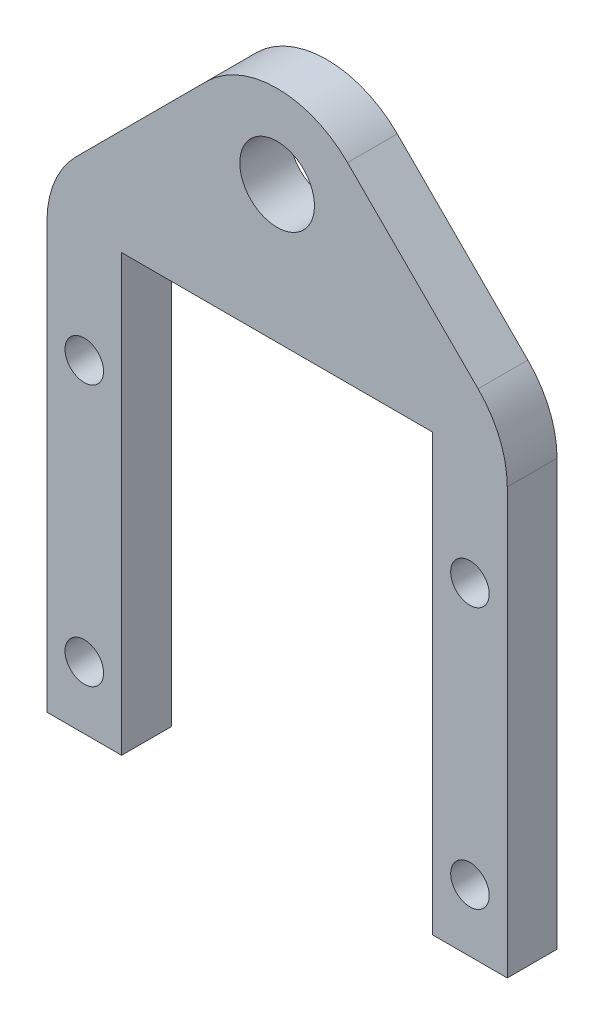
ISO-10303-21;
HEADER;
FILE_DESCRIPTION(('STEP AP214'),'2;1');
FILE_NAME('part.step','',(''),(''),'','','');
FILE_SCHEMA(('AUTOMOTIVE_DESIGN { 1 0 10303 214 1 1 1 1 }'));
ENDSEC;
DATA;
#1=APPLICATION_CONTEXT('core data for automotive mechanical design processes');
#2=APPLICATION_PROTOCOL_DEFINITION('international standard','automotive_design',2000,#1);
#3=PRODUCT_CONTEXT('',#1,'mechanical');
#4=PRODUCT('Part','Part','',(#3));
#5=PRODUCT_RELATED_PRODUCT_CATEGORY('part','',(#4));
#6=PRODUCT_DEFINITION_FORMATION('','',#4);
#7=PRODUCT_DEFINITION_CONTEXT('part definition',#1,'design');
#8=PRODUCT_DEFINITION('design','',#6,#7);
#9=PRODUCT_DEFINITION_SHAPE('','',#8);
#10=(LENGTH_UNIT() NAMED_UNIT(*) SI_UNIT(.MILLI.,.METRE.));
#11=(NAMED_UNIT(*) PLANE_ANGLE_UNIT() SI_UNIT($,.RADIAN.));
#12=(NAMED_UNIT(*) SI_UNIT($,.STERADIAN.) SOLID_ANGLE_UNIT());
#13=UNCERTAINTY_MEASURE_WITH_UNIT(LENGTH_MEASURE(1.E-05),#10,'distance_accuracy_value','');
#14=(GEOMETRIC_REPRESENTATION_CONTEXT(3) GLOBAL_UNCERTAINTY_ASSIGNED_CONTEXT((#13)) GLOBAL_UNIT_ASSIGNED_CONTEXT((#10,
#11,#12)) REPRESENTATION_CONTEXT('',''));
#15=CARTESIAN_POINT('',(0.,0.,0.));
#16=DIRECTION('',(0.,0.,1.));
#17=DIRECTION('',(1.,0.,0.));
#18=AXIS2_PLACEMENT_3D('',#15,#16,#17);
#19=CARTESIAN_POINT('',(0.,0.,4.));
#20=DIRECTION('',(0.,0.,-1.));
#21=DIRECTION('',(-1.,0.,0.));
#22=AXIS2_PLACEMENT_3D('',#19,#20,#21);
#23=PLANE('',#22);
#24=DIRECTION('',(-0.707106781186548,-0.707106781186547,0.));
#25=VECTOR('',#24,1.);
#26=CARTESIAN_POINT('',(-18.5,37.5,4.));
#27=LINE('',#26,#25);
#28=CARTESIAN_POINT('',(-5.65685424949239,50.3431457505076,4.));
#29=VERTEX_POINT('',#28);
#30=CARTESIAN_POINT('',(-16.1568542494924,39.8431457505076,4.));
#31=VERTEX_POINT('',#30);
#32=EDGE_CURVE('E227',#29,#31,#27,.T.);
#33=ORIENTED_EDGE('',*,*,#32,.T.);
#34=CARTESIAN_POINT('',(-10.5,34.1862915010152,4.));
#35=DIRECTION('',(0.,0.,-1.));
#36=DIRECTION('',(-1.,0.,0.));
#37=AXIS2_PLACEMENT_3D('',#34,#35,#36);
#38=CIRCLE('',#37,8.);
#39=CARTESIAN_POINT('',(-18.5,34.1862915010152,4.));
#40=VERTEX_POINT('',#39);
#41=EDGE_CURVE('E172',#31,#40,#38,.F.);
#42=ORIENTED_EDGE('',*,*,#41,.T.);
#43=DIRECTION('',(0.,-1.,0.));
#44=VECTOR('',#43,1.);
#45=CARTESIAN_POINT('',(-18.5,0.,4.));
#46=LINE('',#45,#44);
#47=CARTESIAN_POINT('',(-18.5,0.,4.));
#48=VERTEX_POINT('',#47);
#49=EDGE_CURVE('E225',#40,#48,#46,.T.);
#50=ORIENTED_EDGE('',*,*,#49,.T.);
#51=DIRECTION('',(1.,0.,0.));
#52=VECTOR('',#51,1.);
#53=CARTESIAN_POINT('',(-12.5,0.,4.));
#54=LINE('',#53,#52);
#55=CARTESIAN_POINT('',(-12.5,0.,4.));
#56=VERTEX_POINT('',#55);
#57=EDGE_CURVE('E141',#48,#56,#54,.T.);
#58=ORIENTED_EDGE('',*,*,#57,.T.);
#59=DIRECTION('',(0.,1.,0.));
#60=VECTOR('',#59,1.);
#61=CARTESIAN_POINT('',(-12.5,0.,4.));
#62=LINE('',#61,#60);
#63=CARTESIAN_POINT('',(-12.5,35.,4.));
#64=VERTEX_POINT('',#63);
#65=EDGE_CURVE('E135',#56,#64,#62,.T.);
#66=ORIENTED_EDGE('',*,*,#65,.T.);
#67=DIRECTION('',(1.,0.,0.));
#68=VECTOR('',#67,1.);
#69=CARTESIAN_POINT('',(-12.5,35.,4.));
#70=LINE('',#69,#68);
#71=CARTESIAN_POINT('',(12.5,35.,4.));
#72=VERTEX_POINT('',#71);
#73=EDGE_CURVE('E125',#64,#72,#70,.T.);
#74=ORIENTED_EDGE('',*,*,#73,.T.);
#75=DIRECTION('',(0.,-1.,0.));
#76=VECTOR('',#75,1.);
#77=CARTESIAN_POINT('',(12.5,0.,4.));
#78=LINE('',#77,#76);
#79=CARTESIAN_POINT('',(12.5,0.,4.));
#80=VERTEX_POINT('',#79);
#81=EDGE_CURVE('E134',#72,#80,#78,.T.);
#82=ORIENTED_EDGE('',*,*,#81,.T.);
#83=DIRECTION('',(1.,0.,0.));
#84=VECTOR('',#83,1.);
#85=CARTESIAN_POINT('',(18.5,0.,4.));
#86=LINE('',#85,#84);
#87=CARTESIAN_POINT('',(18.5,0.,4.));
#88=VERTEX_POINT('',#87);
#89=EDGE_CURVE('E214',#80,#88,#86,.T.);
#90=ORIENTED_EDGE('',*,*,#89,.T.);
#91=DIRECTION('',(0.,1.,0.));
#92=VECTOR('',#91,1.);
#93=CARTESIAN_POINT('',(18.5,37.5,4.));
#94=LINE('',#93,#92);
#95=CARTESIAN_POINT('',(18.5,34.1862915010152,4.));
#96=VERTEX_POINT('',#95);
#97=EDGE_CURVE('E230',#88,#96,#94,.T.);
#98=ORIENTED_EDGE('',*,*,#97,.T.);
#99=CARTESIAN_POINT('',(10.5,34.1862915010152,4.));
#100=DIRECTION('',(0.,0.,-1.));
#101=DIRECTION('',(-1.,0.,0.));
#102=AXIS2_PLACEMENT_3D('',#99,#100,#101);
#103=CIRCLE('',#102,8.);
#104=CARTESIAN_POINT('',(16.1568542494924,39.8431457505076,4.));
#105=VERTEX_POINT('',#104);
#106=EDGE_CURVE('E57',#96,#105,#103,.F.);
#107=ORIENTED_EDGE('',*,*,#106,.T.);
#108=DIRECTION('',(-0.707106781186548,0.707106781186548,0.));
#109=VECTOR('',#108,1.);
#110=CARTESIAN_POINT('',(0.,56.,4.));
#111=LINE('',#110,#109);
#112=CARTESIAN_POINT('',(5.65685424949238,50.3431457505076,4.));
#113=VERTEX_POINT('',#112);
#114=EDGE_CURVE('E179',#105,#113,#111,.T.);
#115=ORIENTED_EDGE('',*,*,#114,.T.);
#116=CARTESIAN_POINT('',(0.,44.6862915010152,4.));
#117=DIRECTION('',(0.,0.,-1.));
#118=DIRECTION('',(-1.,0.,0.));
#119=AXIS2_PLACEMENT_3D('',#116,#117,#118);
#120=CIRCLE('',#119,8.);
#121=EDGE_CURVE('E169',#113,#29,#120,.F.);
#122=ORIENTED_EDGE('',*,*,#121,.T.);
#123=EDGE_LOOP('',(#33,#42,#50,#58,#66,#74,#82,#90,#98,#107,#115,#122));
#124=FACE_BOUND('',#123,.T.);
#125=CARTESIAN_POINT('',(-15.5,26.,4.));
#126=DIRECTION('',(0.,0.,1.));
#127=DIRECTION('',(1.,0.,0.));
#128=AXIS2_PLACEMENT_3D('',#125,#126,#127);
#129=CIRCLE('',#128,1.55);
#130=CARTESIAN_POINT('',(-13.95,26.,4.));
#131=VERTEX_POINT('',#130);
#132=EDGE_CURVE('E223',#131,#131,#129,.T.);
#133=ORIENTED_EDGE('',*,*,#132,.F.);
#134=EDGE_LOOP('',(#133));
#135=FACE_BOUND('',#134,.T.);
#136=CARTESIAN_POINT('',(-15.5,5.,4.));
#137=DIRECTION('',(0.,0.,1.));
#138=DIRECTION('',(1.,0.,0.));
#139=AXIS2_PLACEMENT_3D('',#136,#137,#138);
#140=CIRCLE('',#139,1.55);
#141=CARTESIAN_POINT('',(-13.95,5.,4.));
#142=VERTEX_POINT('',#141);
#143=EDGE_CURVE('E237',#142,#142,#140,.T.);
#144=ORIENTED_EDGE('',*,*,#143,.F.);
#145=EDGE_LOOP('',(#144));
#146=FACE_BOUND('',#145,.T.);
#147=CARTESIAN_POINT('',(15.5,5.,4.));
#148=DIRECTION('',(0.,0.,1.));
#149=DIRECTION('',(-1.,0.,0.));
#150=AXIS2_PLACEMENT_3D('',#147,#148,#149);
#151=CIRCLE('',#150,1.55);
#152=CARTESIAN_POINT('',(13.95,5.,4.));
#153=VERTEX_POINT('',#152);
#154=EDGE_CURVE('E243',#153,#153,#151,.T.);
#155=ORIENTED_EDGE('',*,*,#154,.F.);
#156=EDGE_LOOP('',(#155));
#157=FACE_BOUND('',#156,.T.);
#158=CARTESIAN_POINT('',(0.,46.,4.));
#159=DIRECTION('',(0.,0.,1.));
#160=DIRECTION('',(1.,0.,0.));
#161=AXIS2_PLACEMENT_3D('',#158,#159,#160);
#162=CIRCLE('',#161,3.);
#163=CARTESIAN_POINT('',(3.,46.,4.));
#164=VERTEX_POINT('',#163);
#165=EDGE_CURVE('E249',#164,#164,#162,.T.);
#166=ORIENTED_EDGE('',*,*,#165,.F.);
#167=EDGE_LOOP('',(#166));
#168=FACE_BOUND('',#167,.T.);
#169=CARTESIAN_POINT('',(15.5,26.,4.));
#170=DIRECTION('',(0.,0.,1.));
#171=DIRECTION('',(-1.,0.,0.));
#172=AXIS2_PLACEMENT_3D('',#169,#170,#171);
#173=CIRCLE('',#172,1.55);
#174=CARTESIAN_POINT('',(13.95,26.,4.));
#175=VERTEX_POINT('',#174);
#176=EDGE_CURVE('E255',#175,#175,#173,.T.);
#177=ORIENTED_EDGE('',*,*,#176,.F.);
#178=EDGE_LOOP('',(#177));
#179=FACE_BOUND('',#178,.T.);
#180=ADVANCED_FACE('F35',(#124,#135,#146,#157,#168,#179),#23,.F.);
#181=CARTESIAN_POINT('',(0.,0.,0.));
#182=DIRECTION('',(0.,0.,-1.));
#183=DIRECTION('',(-1.,0.,0.));
#184=AXIS2_PLACEMENT_3D('',#181,#182,#183);
#185=PLANE('',#184);
#186=CARTESIAN_POINT('',(0.,46.,0.));
#187=DIRECTION('',(0.,0.,1.));
#188=DIRECTION('',(1.,0.,0.));
#189=AXIS2_PLACEMENT_3D('',#186,#187,#188);
#190=CIRCLE('',#189,3.);
#191=CARTESIAN_POINT('',(3.,46.,0.));
#192=VERTEX_POINT('',#191);
#193=EDGE_CURVE('E252',#192,#192,#190,.T.);
#194=ORIENTED_EDGE('',*,*,#193,.T.);
#195=EDGE_LOOP('',(#194));
#196=FACE_BOUND('',#195,.T.);
#197=CARTESIAN_POINT('',(-15.5,5.,0.));
#198=DIRECTION('',(0.,0.,1.));
#199=DIRECTION('',(1.,0.,0.));
#200=AXIS2_PLACEMENT_3D('',#197,#198,#199);
#201=CIRCLE('',#200,1.55);
#202=CARTESIAN_POINT('',(-13.95,5.,0.));
#203=VERTEX_POINT('',#202);
#204=EDGE_CURVE('E240',#203,#203,#201,.T.);
#205=ORIENTED_EDGE('',*,*,#204,.T.);
#206=EDGE_LOOP('',(#205));
#207=FACE_BOUND('',#206,.T.);
#208=DIRECTION('',(0.,-1.,0.));
#209=VECTOR('',#208,1.);
#210=CARTESIAN_POINT('',(-18.5,0.,0.));
#211=LINE('',#210,#209);
#212=CARTESIAN_POINT('',(-18.5,34.1862915010152,0.));
#213=VERTEX_POINT('',#212);
#214=CARTESIAN_POINT('',(-18.5,0.,0.));
#215=VERTEX_POINT('',#214);
#216=EDGE_CURVE('E192',#213,#215,#211,.T.);
#217=ORIENTED_EDGE('',*,*,#216,.F.);
#218=CARTESIAN_POINT('',(-10.5,34.1862915010152,0.));
#219=DIRECTION('',(0.,0.,-1.));
#220=DIRECTION('',(-1.,0.,0.));
#221=AXIS2_PLACEMENT_3D('',#218,#219,#220);
#222=CIRCLE('',#221,8.);
#223=CARTESIAN_POINT('',(-16.1568542494924,39.8431457505076,0.));
#224=VERTEX_POINT('',#223);
#225=EDGE_CURVE('E162',#213,#224,#222,.T.);
#226=ORIENTED_EDGE('',*,*,#225,.T.);
#227=DIRECTION('',(-0.707106781186548,-0.707106781186547,0.));
#228=VECTOR('',#227,1.);
#229=CARTESIAN_POINT('',(-18.5,37.5,0.));
#230=LINE('',#229,#228);
#231=CARTESIAN_POINT('',(-5.65685424949239,50.3431457505076,0.));
#232=VERTEX_POINT('',#231);
#233=EDGE_CURVE('E188',#232,#224,#230,.T.);
#234=ORIENTED_EDGE('',*,*,#233,.F.);
#235=CARTESIAN_POINT('',(0.,44.6862915010152,0.));
#236=DIRECTION('',(0.,0.,-1.));
#237=DIRECTION('',(-1.,0.,0.));
#238=AXIS2_PLACEMENT_3D('',#235,#236,#237);
#239=CIRCLE('',#238,8.);
#240=CARTESIAN_POINT('',(5.65685424949238,50.3431457505076,0.));
#241=VERTEX_POINT('',#240);
#242=EDGE_CURVE('E153',#232,#241,#239,.T.);
#243=ORIENTED_EDGE('',*,*,#242,.T.);
#244=DIRECTION('',(-0.707106781186548,0.707106781186548,0.));
#245=VECTOR('',#244,1.);
#246=CARTESIAN_POINT('',(0.,56.,0.));
#247=LINE('',#246,#245);
#248=CARTESIAN_POINT('',(16.1568542494924,39.8431457505076,0.));
#249=VERTEX_POINT('',#248);
#250=EDGE_CURVE('E178',#249,#241,#247,.T.);
#251=ORIENTED_EDGE('',*,*,#250,.F.);
#252=CARTESIAN_POINT('',(10.5,34.1862915010152,0.));
#253=DIRECTION('',(0.,0.,-1.));
#254=DIRECTION('',(-1.,0.,0.));
#255=AXIS2_PLACEMENT_3D('',#252,#253,#254);
#256=CIRCLE('',#255,8.);
#257=CARTESIAN_POINT('',(18.5,34.1862915010152,0.));
#258=VERTEX_POINT('',#257);
#259=EDGE_CURVE('E160',#249,#258,#256,.T.);
#260=ORIENTED_EDGE('',*,*,#259,.T.);
#261=DIRECTION('',(0.,1.,0.));
#262=VECTOR('',#261,1.);
#263=CARTESIAN_POINT('',(18.5,37.5,0.));
#264=LINE('',#263,#262);
#265=CARTESIAN_POINT('',(18.5,0.,0.));
#266=VERTEX_POINT('',#265);
#267=EDGE_CURVE('E189',#266,#258,#264,.T.);
#268=ORIENTED_EDGE('',*,*,#267,.F.);
#269=DIRECTION('',(1.,0.,0.));
#270=VECTOR('',#269,1.);
#271=CARTESIAN_POINT('',(18.5,0.,0.));
#272=LINE('',#271,#270);
#273=CARTESIAN_POINT('',(12.5,0.,0.));
#274=VERTEX_POINT('',#273);
#275=EDGE_CURVE('E194',#274,#266,#272,.T.);
#276=ORIENTED_EDGE('',*,*,#275,.F.);
#277=DIRECTION('',(0.,-1.,0.));
#278=VECTOR('',#277,1.);
#279=CARTESIAN_POINT('',(12.5,0.,0.));
#280=LINE('',#279,#278);
#281=CARTESIAN_POINT('',(12.5,35.,0.));
#282=VERTEX_POINT('',#281);
#283=EDGE_CURVE('E217',#282,#274,#280,.T.);
#284=ORIENTED_EDGE('',*,*,#283,.F.);
#285=DIRECTION('',(1.,0.,0.));
#286=VECTOR('',#285,1.);
#287=CARTESIAN_POINT('',(-12.5,35.,0.));
#288=LINE('',#287,#286);
#289=CARTESIAN_POINT('',(-12.5,35.,0.));
#290=VERTEX_POINT('',#289);
#291=EDGE_CURVE('E218',#290,#282,#288,.T.);
#292=ORIENTED_EDGE('',*,*,#291,.F.);
#293=DIRECTION('',(0.,1.,0.));
#294=VECTOR('',#293,1.);
#295=CARTESIAN_POINT('',(-12.5,0.,0.));
#296=LINE('',#295,#294);
#297=CARTESIAN_POINT('',(-12.5,0.,0.));
#298=VERTEX_POINT('',#297);
#299=EDGE_CURVE('E149',#298,#290,#296,.T.);
#300=ORIENTED_EDGE('',*,*,#299,.F.);
#301=DIRECTION('',(1.,0.,0.));
#302=VECTOR('',#301,1.);
#303=CARTESIAN_POINT('',(-12.5,0.,0.));
#304=LINE('',#303,#302);
#305=EDGE_CURVE('E145',#215,#298,#304,.T.);
#306=ORIENTED_EDGE('',*,*,#305,.F.);
#307=EDGE_LOOP('',(#217,#226,#234,#243,#251,#260,#268,#276,#284,#292,#300,#306));
#308=FACE_BOUND('',#307,.T.);
#309=CARTESIAN_POINT('',(-15.5,26.,0.));
#310=DIRECTION('',(0.,0.,1.));
#311=DIRECTION('',(1.,0.,0.));
#312=AXIS2_PLACEMENT_3D('',#309,#310,#311);
#313=CIRCLE('',#312,1.55);
#314=CARTESIAN_POINT('',(-13.95,26.,0.));
#315=VERTEX_POINT('',#314);
#316=EDGE_CURVE('E234',#315,#315,#313,.T.);
#317=ORIENTED_EDGE('',*,*,#316,.T.);
#318=EDGE_LOOP('',(#317));
#319=FACE_BOUND('',#318,.T.);
#320=CARTESIAN_POINT('',(15.5,5.,0.));
#321=DIRECTION('',(0.,0.,1.));
#322=DIRECTION('',(-1.,0.,0.));
#323=AXIS2_PLACEMENT_3D('',#320,#321,#322);
#324=CIRCLE('',#323,1.55);
#325=CARTESIAN_POINT('',(13.95,5.,0.));
#326=VERTEX_POINT('',#325);
#327=EDGE_CURVE('E246',#326,#326,#324,.T.);
#328=ORIENTED_EDGE('',*,*,#327,.T.);
#329=EDGE_LOOP('',(#328));
#330=FACE_BOUND('',#329,.T.);
#331=CARTESIAN_POINT('',(15.5,26.,0.));
#332=DIRECTION('',(0.,0.,1.));
#333=DIRECTION('',(-1.,0.,0.));
#334=AXIS2_PLACEMENT_3D('',#331,#332,#333);
#335=CIRCLE('',#334,1.55);
#336=CARTESIAN_POINT('',(13.95,26.,0.));
#337=VERTEX_POINT('',#336);
#338=EDGE_CURVE('E258',#337,#337,#335,.T.);
#339=ORIENTED_EDGE('',*,*,#338,.T.);
#340=EDGE_LOOP('',(#339));
#341=FACE_BOUND('',#340,.T.);
#342=ADVANCED_FACE('F183',(#196,#207,#308,#319,#330,#341),#185,.T.);
#343=CARTESIAN_POINT('',(-12.5,0.,4.));
#344=DIRECTION('',(-1.,0.,0.));
#345=DIRECTION('',(0.,0.,1.));
#346=AXIS2_PLACEMENT_3D('',#343,#344,#345);
#347=PLANE('',#346);
#348=ORIENTED_EDGE('',*,*,#299,.T.);
#349=DIRECTION('',(0.,0.,-1.));
#350=VECTOR('',#349,1.);
#351=CARTESIAN_POINT('',(-12.5,35.,4.));
#352=LINE('',#351,#350);
#353=EDGE_CURVE('E129',#64,#290,#352,.T.);
#354=ORIENTED_EDGE('',*,*,#353,.F.);
#355=ORIENTED_EDGE('',*,*,#65,.F.);
#356=DIRECTION('',(0.,0.,-1.));
#357=VECTOR('',#356,1.);
#358=CARTESIAN_POINT('',(-12.5,0.,4.));
#359=LINE('',#358,#357);
#360=EDGE_CURVE('E200',#56,#298,#359,.T.);
#361=ORIENTED_EDGE('',*,*,#360,.T.);
#362=EDGE_LOOP('',(#348,#354,#355,#361));
#363=FACE_BOUND('',#362,.T.);
#364=ADVANCED_FACE('F147',(#363),#347,.F.);
#365=CARTESIAN_POINT('',(-12.5,35.,4.));
#366=DIRECTION('',(0.,1.,0.));
#367=DIRECTION('',(0.,0.,1.));
#368=AXIS2_PLACEMENT_3D('',#365,#366,#367);
#369=PLANE('',#368);
#370=ORIENTED_EDGE('',*,*,#291,.T.);
#371=DIRECTION('',(0.,0.,-1.));
#372=VECTOR('',#371,1.);
#373=CARTESIAN_POINT('',(12.5,35.,4.));
#374=LINE('',#373,#372);
#375=EDGE_CURVE('E132',#72,#282,#374,.T.);
#376=ORIENTED_EDGE('',*,*,#375,.F.);
#377=ORIENTED_EDGE('',*,*,#73,.F.);
#378=ORIENTED_EDGE('',*,*,#353,.T.);
#379=EDGE_LOOP('',(#370,#376,#377,#378));
#380=FACE_BOUND('',#379,.T.);
#381=ADVANCED_FACE('F127',(#380),#369,.F.);
#382=CARTESIAN_POINT('',(12.5,0.,4.));
#383=DIRECTION('',(1.,0.,0.));
#384=DIRECTION('',(0.,0.,-1.));
#385=AXIS2_PLACEMENT_3D('',#382,#383,#384);
#386=PLANE('',#385);
#387=ORIENTED_EDGE('',*,*,#283,.T.);
#388=DIRECTION('',(0.,0.,-1.));
#389=VECTOR('',#388,1.);
#390=CARTESIAN_POINT('',(12.5,0.,4.));
#391=LINE('',#390,#389);
#392=EDGE_CURVE('E155',#80,#274,#391,.T.);
#393=ORIENTED_EDGE('',*,*,#392,.F.);
#394=ORIENTED_EDGE('',*,*,#81,.F.);
#395=ORIENTED_EDGE('',*,*,#375,.T.);
#396=EDGE_LOOP('',(#387,#393,#394,#395));
#397=FACE_BOUND('',#396,.T.);
#398=ADVANCED_FACE('F298',(#397),#386,.F.);
#399=CARTESIAN_POINT('',(18.5,0.,4.));
#400=DIRECTION('',(0.,1.,0.));
#401=DIRECTION('',(0.,0.,1.));
#402=AXIS2_PLACEMENT_3D('',#399,#400,#401);
#403=PLANE('',#402);
#404=ORIENTED_EDGE('',*,*,#275,.T.);
#405=DIRECTION('',(0.,0.,-1.));
#406=VECTOR('',#405,1.);
#407=CARTESIAN_POINT('',(18.5,0.,4.));
#408=LINE('',#407,#406);
#409=EDGE_CURVE('E205',#88,#266,#408,.T.);
#410=ORIENTED_EDGE('',*,*,#409,.F.);
#411=ORIENTED_EDGE('',*,*,#89,.F.);
#412=ORIENTED_EDGE('',*,*,#392,.T.);
#413=EDGE_LOOP('',(#404,#410,#411,#412));
#414=FACE_BOUND('',#413,.T.);
#415=ADVANCED_FACE('F212',(#414),#403,.F.);
#416=CARTESIAN_POINT('',(18.5,37.5,4.));
#417=DIRECTION('',(-1.,0.,0.));
#418=DIRECTION('',(0.,-1.,0.));
#419=AXIS2_PLACEMENT_3D('',#416,#417,#418);
#420=PLANE('',#419);
#421=ORIENTED_EDGE('',*,*,#267,.T.);
#422=DIRECTION('',(0.,0.,-1.));
#423=VECTOR('',#422,1.);
#424=CARTESIAN_POINT('',(18.5,34.1862915010152,4.));
#425=LINE('',#424,#423);
#426=EDGE_CURVE('E11',#258,#96,#425,.F.);
#427=ORIENTED_EDGE('',*,*,#426,.T.);
#428=ORIENTED_EDGE('',*,*,#97,.F.);
#429=ORIENTED_EDGE('',*,*,#409,.T.);
#430=EDGE_LOOP('',(#421,#427,#428,#429));
#431=FACE_BOUND('',#430,.T.);
#432=ADVANCED_FACE('F292',(#431),#420,.F.);
#433=CARTESIAN_POINT('',(0.,56.,4.));
#434=DIRECTION('',(-0.707106781186547,-0.707106781186547,0.));
#435=DIRECTION('',(0.707106781186548,-0.707106781186548,0.));
#436=AXIS2_PLACEMENT_3D('',#433,#434,#435);
#437=PLANE('',#436);
#438=ORIENTED_EDGE('',*,*,#114,.F.);
#439=DIRECTION('',(0.,0.,-1.));
#440=VECTOR('',#439,1.);
#441=CARTESIAN_POINT('',(16.1568542494924,39.8431457505076,4.));
#442=LINE('',#441,#440);
#443=EDGE_CURVE('E43',#105,#249,#442,.T.);
#444=ORIENTED_EDGE('',*,*,#443,.T.);
#445=ORIENTED_EDGE('',*,*,#250,.T.);
#446=DIRECTION('',(0.,0.,-1.));
#447=VECTOR('',#446,1.);
#448=CARTESIAN_POINT('',(5.65685424949238,50.3431457505076,4.));
#449=LINE('',#448,#447);
#450=EDGE_CURVE('E50',#241,#113,#449,.F.);
#451=ORIENTED_EDGE('',*,*,#450,.T.);
#452=EDGE_LOOP('',(#438,#444,#445,#451));
#453=FACE_BOUND('',#452,.T.);
#454=ADVANCED_FACE('F177',(#453),#437,.F.);
#455=CARTESIAN_POINT('',(-18.5,37.5,4.));
#456=DIRECTION('',(0.707106781186547,-0.707106781186548,0.));
#457=DIRECTION('',(0.707106781186548,0.707106781186547,0.));
#458=AXIS2_PLACEMENT_3D('',#455,#456,#457);
#459=PLANE('',#458);
#460=ORIENTED_EDGE('',*,*,#233,.T.);
#461=DIRECTION('',(0.,0.,-1.));
#462=VECTOR('',#461,1.);
#463=CARTESIAN_POINT('',(-16.1568542494924,39.8431457505076,4.));
#464=LINE('',#463,#462);
#465=EDGE_CURVE('E167',#224,#31,#464,.F.);
#466=ORIENTED_EDGE('',*,*,#465,.T.);
#467=ORIENTED_EDGE('',*,*,#32,.F.);
#468=DIRECTION('',(0.,0.,-1.));
#469=VECTOR('',#468,1.);
#470=CARTESIAN_POINT('',(-5.65685424949239,50.3431457505076,4.));
#471=LINE('',#470,#469);
#472=EDGE_CURVE('E164',#29,#232,#471,.T.);
#473=ORIENTED_EDGE('',*,*,#472,.T.);
#474=EDGE_LOOP('',(#460,#466,#467,#473));
#475=FACE_BOUND('',#474,.T.);
#476=ADVANCED_FACE('F285',(#475),#459,.F.);
#477=CARTESIAN_POINT('',(-18.5,0.,4.));
#478=DIRECTION('',(1.,0.,0.));
#479=DIRECTION('',(0.,0.,-1.));
#480=AXIS2_PLACEMENT_3D('',#477,#478,#479);
#481=PLANE('',#480);
#482=ORIENTED_EDGE('',*,*,#49,.F.);
#483=DIRECTION('',(0.,0.,-1.));
#484=VECTOR('',#483,1.);
#485=CARTESIAN_POINT('',(-18.5,34.1862915010152,4.));
#486=LINE('',#485,#484);
#487=EDGE_CURVE('E150',#40,#213,#486,.T.);
#488=ORIENTED_EDGE('',*,*,#487,.T.);
#489=ORIENTED_EDGE('',*,*,#216,.T.);
#490=DIRECTION('',(0.,0.,-1.));
#491=VECTOR('',#490,1.);
#492=CARTESIAN_POINT('',(-18.5,0.,4.));
#493=LINE('',#492,#491);
#494=EDGE_CURVE('E202',#48,#215,#493,.T.);
#495=ORIENTED_EDGE('',*,*,#494,.F.);
#496=EDGE_LOOP('',(#482,#488,#489,#495));
#497=FACE_BOUND('',#496,.T.);
#498=ADVANCED_FACE('F281',(#497),#481,.F.);
#499=CARTESIAN_POINT('',(-12.5,0.,4.));
#500=DIRECTION('',(0.,1.,0.));
#501=DIRECTION('',(0.,0.,1.));
#502=AXIS2_PLACEMENT_3D('',#499,#500,#501);
#503=PLANE('',#502);
#504=ORIENTED_EDGE('',*,*,#305,.T.);
#505=ORIENTED_EDGE('',*,*,#360,.F.);
#506=ORIENTED_EDGE('',*,*,#57,.F.);
#507=ORIENTED_EDGE('',*,*,#494,.T.);
#508=EDGE_LOOP('',(#504,#505,#506,#507));
#509=FACE_BOUND('',#508,.T.);
#510=ADVANCED_FACE('F278',(#509),#503,.F.);
#511=CARTESIAN_POINT('',(-15.5,26.,4.));
#512=DIRECTION('',(0.,0.,-1.));
#513=DIRECTION('',(-1.,0.,0.));
#514=AXIS2_PLACEMENT_3D('',#511,#512,#513);
#515=CYLINDRICAL_SURFACE('',#514,1.55);
#516=ORIENTED_EDGE('',*,*,#132,.T.);
#517=EDGE_LOOP('',(#516));
#518=FACE_BOUND('',#517,.T.);
#519=ORIENTED_EDGE('',*,*,#316,.F.);
#520=EDGE_LOOP('',(#519));
#521=FACE_BOUND('',#520,.T.);
#522=ADVANCED_FACE('F275',(#518,#521),#515,.F.);
#523=CARTESIAN_POINT('',(-15.5,5.,4.));
#524=DIRECTION('',(0.,0.,-1.));
#525=DIRECTION('',(-1.,0.,0.));
#526=AXIS2_PLACEMENT_3D('',#523,#524,#525);
#527=CYLINDRICAL_SURFACE('',#526,1.55);
#528=ORIENTED_EDGE('',*,*,#143,.T.);
#529=EDGE_LOOP('',(#528));
#530=FACE_BOUND('',#529,.T.);
#531=ORIENTED_EDGE('',*,*,#204,.F.);
#532=EDGE_LOOP('',(#531));
#533=FACE_BOUND('',#532,.T.);
#534=ADVANCED_FACE('F402',(#530,#533),#527,.F.);
#535=CARTESIAN_POINT('',(15.5,5.,4.));
#536=DIRECTION('',(0.,0.,-1.));
#537=DIRECTION('',(-1.,0.,0.));
#538=AXIS2_PLACEMENT_3D('',#535,#536,#537);
#539=CYLINDRICAL_SURFACE('',#538,1.55);
#540=ORIENTED_EDGE('',*,*,#154,.T.);
#541=EDGE_LOOP('',(#540));
#542=FACE_BOUND('',#541,.T.);
#543=ORIENTED_EDGE('',*,*,#327,.F.);
#544=EDGE_LOOP('',(#543));
#545=FACE_BOUND('',#544,.T.);
#546=ADVANCED_FACE('F392',(#542,#545),#539,.F.);
#547=CARTESIAN_POINT('',(0.,46.,4.));
#548=DIRECTION('',(0.,0.,-1.));
#549=DIRECTION('',(-1.,0.,0.));
#550=AXIS2_PLACEMENT_3D('',#547,#548,#549);
#551=CYLINDRICAL_SURFACE('',#550,3.);
#552=ORIENTED_EDGE('',*,*,#165,.T.);
#553=EDGE_LOOP('',(#552));
#554=FACE_BOUND('',#553,.T.);
#555=ORIENTED_EDGE('',*,*,#193,.F.);
#556=EDGE_LOOP('',(#555));
#557=FACE_BOUND('',#556,.T.);
#558=ADVANCED_FACE('F383',(#554,#557),#551,.F.);
#559=CARTESIAN_POINT('',(15.5,26.,4.));
#560=DIRECTION('',(0.,0.,-1.));
#561=DIRECTION('',(-1.,0.,0.));
#562=AXIS2_PLACEMENT_3D('',#559,#560,#561);
#563=CYLINDRICAL_SURFACE('',#562,1.55);
#564=ORIENTED_EDGE('',*,*,#176,.T.);
#565=EDGE_LOOP('',(#564));
#566=FACE_BOUND('',#565,.T.);
#567=ORIENTED_EDGE('',*,*,#338,.F.);
#568=EDGE_LOOP('',(#567));
#569=FACE_BOUND('',#568,.T.);
#570=ADVANCED_FACE('F264',(#566,#569),#563,.F.);
#571=CARTESIAN_POINT('',(-10.5,34.1862915010152,4.));
#572=DIRECTION('',(0.,0.,-1.));
#573=DIRECTION('',(-1.,0.,0.));
#574=AXIS2_PLACEMENT_3D('',#571,#572,#573);
#575=CYLINDRICAL_SURFACE('',#574,8.);
#576=ORIENTED_EDGE('',*,*,#41,.F.);
#577=ORIENTED_EDGE('',*,*,#465,.F.);
#578=ORIENTED_EDGE('',*,*,#225,.F.);
#579=ORIENTED_EDGE('',*,*,#487,.F.);
#580=EDGE_LOOP('',(#576,#577,#578,#579));
#581=FACE_BOUND('',#580,.T.);
#582=ADVANCED_FACE('F305',(#581),#575,.T.);
#583=CARTESIAN_POINT('',(10.5,34.1862915010152,4.));
#584=DIRECTION('',(0.,0.,-1.));
#585=DIRECTION('',(-1.,0.,0.));
#586=AXIS2_PLACEMENT_3D('',#583,#584,#585);
#587=CYLINDRICAL_SURFACE('',#586,8.);
#588=ORIENTED_EDGE('',*,*,#106,.F.);
#589=ORIENTED_EDGE('',*,*,#426,.F.);
#590=ORIENTED_EDGE('',*,*,#259,.F.);
#591=ORIENTED_EDGE('',*,*,#443,.F.);
#592=EDGE_LOOP('',(#588,#589,#590,#591));
#593=FACE_BOUND('',#592,.T.);
#594=ADVANCED_FACE('F307',(#593),#587,.T.);
#595=CARTESIAN_POINT('',(0.,44.6862915010152,4.));
#596=DIRECTION('',(0.,0.,-1.));
#597=DIRECTION('',(-1.,0.,0.));
#598=AXIS2_PLACEMENT_3D('',#595,#596,#597);
#599=CYLINDRICAL_SURFACE('',#598,8.);
#600=ORIENTED_EDGE('',*,*,#121,.F.);
#601=ORIENTED_EDGE('',*,*,#450,.F.);
#602=ORIENTED_EDGE('',*,*,#242,.F.);
#603=ORIENTED_EDGE('',*,*,#472,.F.);
#604=EDGE_LOOP('',(#600,#601,#602,#603));
#605=FACE_BOUND('',#604,.T.);
#606=ADVANCED_FACE('F37',(#605),#599,.T.);
#607=CLOSED_SHELL('',(#180,#342,#364,#381,#398,#415,#432,#454,#476,#498,#510,#522,#534,#546,
#558,#570,#582,#594,#606));
#608=MANIFOLD_SOLID_BREP('B2',#607);
#609=ADVANCED_BREP_SHAPE_REPRESENTATION('',(#18,#608),#14);
#610=SHAPE_DEFINITION_REPRESENTATION(#9,#609);
ENDSEC;
END-ISO-10303-21;
